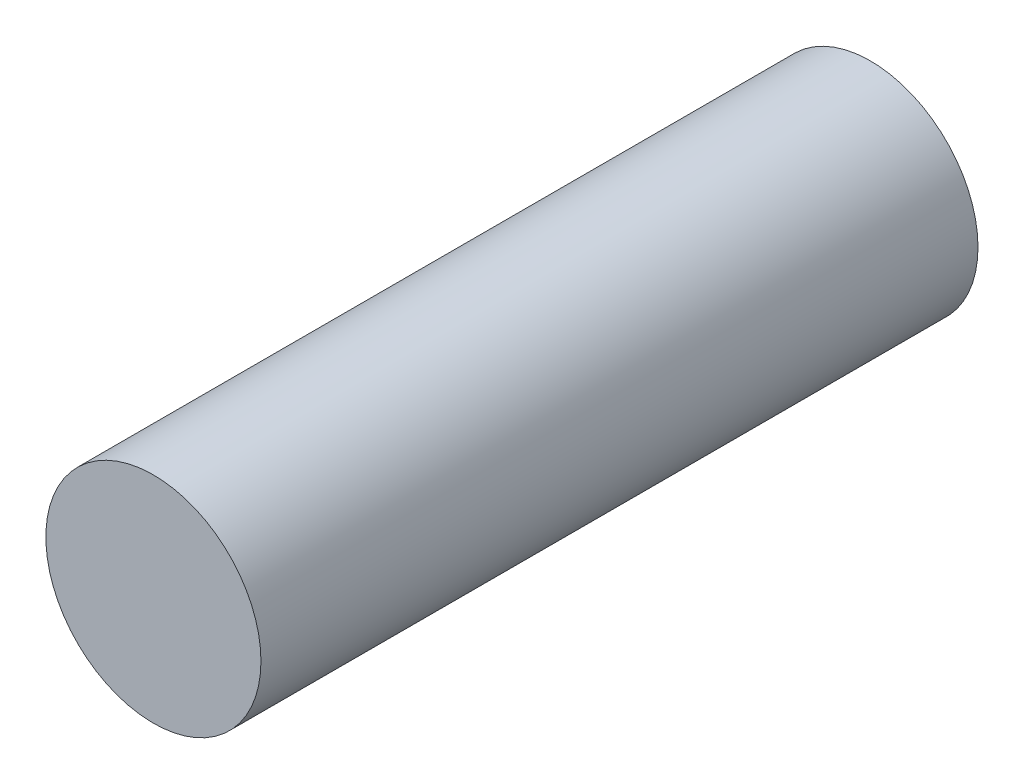
ISO-10303-21;
HEADER;
FILE_DESCRIPTION(('STEP AP214'),'2;1');
FILE_NAME('part.step','',(''),(''),'','','');
FILE_SCHEMA(('AUTOMOTIVE_DESIGN { 1 0 10303 214 1 1 1 1 }'));
ENDSEC;
DATA;
#1=APPLICATION_CONTEXT('core data for automotive mechanical design processes');
#2=APPLICATION_PROTOCOL_DEFINITION('international standard','automotive_design',2000,#1);
#3=PRODUCT_CONTEXT('',#1,'mechanical');
#4=PRODUCT('Part','Part','',(#3));
#5=PRODUCT_RELATED_PRODUCT_CATEGORY('part','',(#4));
#6=PRODUCT_DEFINITION_FORMATION('','',#4);
#7=PRODUCT_DEFINITION_CONTEXT('part definition',#1,'design');
#8=PRODUCT_DEFINITION('design','',#6,#7);
#9=PRODUCT_DEFINITION_SHAPE('','',#8);
#10=(LENGTH_UNIT() NAMED_UNIT(*) SI_UNIT(.MILLI.,.METRE.));
#11=(NAMED_UNIT(*) PLANE_ANGLE_UNIT() SI_UNIT($,.RADIAN.));
#12=(NAMED_UNIT(*) SI_UNIT($,.STERADIAN.) SOLID_ANGLE_UNIT());
#13=UNCERTAINTY_MEASURE_WITH_UNIT(LENGTH_MEASURE(1.E-05),#10,'distance_accuracy_value','');
#14=(GEOMETRIC_REPRESENTATION_CONTEXT(3) GLOBAL_UNCERTAINTY_ASSIGNED_CONTEXT((#13)) GLOBAL_UNIT_ASSIGNED_CONTEXT((#10,
#11,#12)) REPRESENTATION_CONTEXT('',''));
#15=CARTESIAN_POINT('',(0.,0.,0.));
#16=DIRECTION('',(0.,0.,1.));
#17=DIRECTION('',(1.,0.,0.));
#18=AXIS2_PLACEMENT_3D('',#15,#16,#17);
#19=CARTESIAN_POINT('',(0.,0.,15.));
#20=DIRECTION('',(0.,0.,-1.));
#21=DIRECTION('',(-1.,0.,0.));
#22=AXIS2_PLACEMENT_3D('',#19,#20,#21);
#23=CYLINDRICAL_SURFACE('',#22,2.25);
#24=CARTESIAN_POINT('',(0.,0.,15.));
#25=DIRECTION('',(0.,0.,1.));
#26=DIRECTION('',(1.,0.,0.));
#27=AXIS2_PLACEMENT_3D('',#24,#25,#26);
#28=CIRCLE('',#27,2.25);
#29=CARTESIAN_POINT('',(2.25,0.,15.));
#30=VERTEX_POINT('',#29);
#31=EDGE_CURVE('E10',#30,#30,#28,.T.);
#32=ORIENTED_EDGE('',*,*,#31,.F.);
#33=EDGE_LOOP('',(#32));
#34=FACE_BOUND('',#33,.T.);
#35=CARTESIAN_POINT('',(0.,0.,0.));
#36=DIRECTION('',(0.,0.,1.));
#37=DIRECTION('',(1.,0.,0.));
#38=AXIS2_PLACEMENT_3D('',#35,#36,#37);
#39=CIRCLE('',#38,2.25);
#40=CARTESIAN_POINT('',(2.25,0.,0.));
#41=VERTEX_POINT('',#40);
#42=EDGE_CURVE('E40',#41,#41,#39,.T.);
#43=ORIENTED_EDGE('',*,*,#42,.T.);
#44=EDGE_LOOP('',(#43));
#45=FACE_BOUND('',#44,.T.);
#46=ADVANCED_FACE('F37',(#34,#45),#23,.T.);
#47=CARTESIAN_POINT('',(0.,0.,15.));
#48=DIRECTION('',(0.,0.,1.));
#49=DIRECTION('',(1.,0.,0.));
#50=AXIS2_PLACEMENT_3D('',#47,#48,#49);
#51=PLANE('',#50);
#52=ORIENTED_EDGE('',*,*,#31,.T.);
#53=EDGE_LOOP('',(#52));
#54=FACE_BOUND('',#53,.T.);
#55=ADVANCED_FACE('F54',(#54),#51,.T.);
#56=CARTESIAN_POINT('',(0.,0.,0.));
#57=DIRECTION('',(0.,0.,1.));
#58=DIRECTION('',(1.,0.,0.));
#59=AXIS2_PLACEMENT_3D('',#56,#57,#58);
#60=PLANE('',#59);
#61=ORIENTED_EDGE('',*,*,#42,.F.);
#62=EDGE_LOOP('',(#61));
#63=FACE_BOUND('',#62,.T.);
#64=ADVANCED_FACE('F52',(#63),#60,.F.);
#65=CLOSED_SHELL('',(#46,#55,#64));
#66=MANIFOLD_SOLID_BREP('B2',#65);
#67=ADVANCED_BREP_SHAPE_REPRESENTATION('',(#18,#66),#14);
#68=SHAPE_DEFINITION_REPRESENTATION(#9,#67);
ENDSEC;
END-ISO-10303-21;
